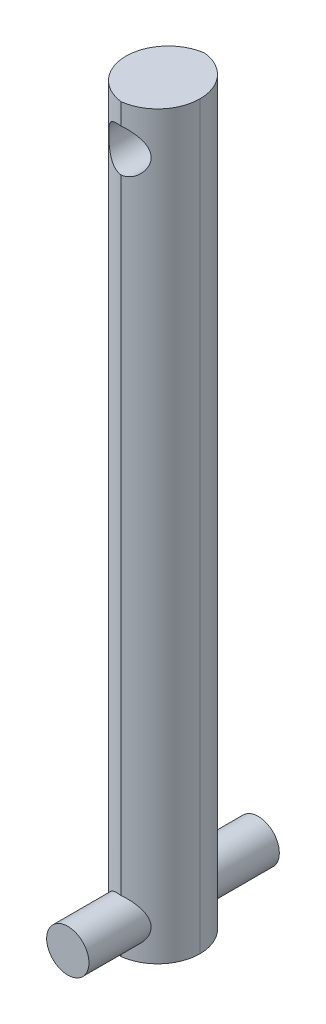
ISO-10303-21;
HEADER;
FILE_DESCRIPTION(('STEP AP214'),'2;1');
FILE_NAME('part.step','',(''),(''),'','','');
FILE_SCHEMA(('AUTOMOTIVE_DESIGN { 1 0 10303 214 1 1 1 1 }'));
ENDSEC;
DATA;
#1=APPLICATION_CONTEXT('core data for automotive mechanical design processes');
#2=APPLICATION_PROTOCOL_DEFINITION('international standard','automotive_design',2000,#1);
#3=PRODUCT_CONTEXT('',#1,'mechanical');
#4=PRODUCT('Part','Part','',(#3));
#5=PRODUCT_RELATED_PRODUCT_CATEGORY('part','',(#4));
#6=PRODUCT_DEFINITION_FORMATION('','',#4);
#7=PRODUCT_DEFINITION_CONTEXT('part definition',#1,'design');
#8=PRODUCT_DEFINITION('design','',#6,#7);
#9=PRODUCT_DEFINITION_SHAPE('','',#8);
#10=(LENGTH_UNIT() NAMED_UNIT(*) SI_UNIT(.MILLI.,.METRE.));
#11=(NAMED_UNIT(*) PLANE_ANGLE_UNIT() SI_UNIT($,.RADIAN.));
#12=(NAMED_UNIT(*) SI_UNIT($,.STERADIAN.) SOLID_ANGLE_UNIT());
#13=UNCERTAINTY_MEASURE_WITH_UNIT(LENGTH_MEASURE(1.E-05),#10,'distance_accuracy_value','');
#14=(GEOMETRIC_REPRESENTATION_CONTEXT(3) GLOBAL_UNCERTAINTY_ASSIGNED_CONTEXT((#13)) GLOBAL_UNIT_ASSIGNED_CONTEXT((#10,
#11,#12)) REPRESENTATION_CONTEXT('',''));
#15=CARTESIAN_POINT('',(0.,0.,0.));
#16=DIRECTION('',(0.,0.,1.));
#17=DIRECTION('',(1.,0.,0.));
#18=AXIS2_PLACEMENT_3D('',#15,#16,#17);
#19=CARTESIAN_POINT('',(0.,70.,0.));
#20=DIRECTION('',(0.,1.,0.));
#21=DIRECTION('',(0.,0.,1.));
#22=AXIS2_PLACEMENT_3D('',#19,#20,#21);
#23=PLANE('',#22);
#24=CARTESIAN_POINT('',(0.499999999999999,70.,0.));
#25=DIRECTION('',(0.,1.,0.));
#26=DIRECTION('',(0.,0.,1.));
#27=AXIS2_PLACEMENT_3D('',#24,#25,#26);
#28=CIRCLE('',#27,4.);
#29=CARTESIAN_POINT('',(0.,70.,-3.96862696659689));
#30=VERTEX_POINT('',#29);
#31=CARTESIAN_POINT('',(-3.5,70.,0.));
#32=VERTEX_POINT('',#31);
#33=EDGE_CURVE('E239',#30,#32,#28,.T.);
#34=ORIENTED_EDGE('',*,*,#33,.T.);
#35=CARTESIAN_POINT('',(0.5,70.,0.));
#36=DIRECTION('',(0.,1.,0.));
#37=DIRECTION('',(0.,0.,1.));
#38=AXIS2_PLACEMENT_3D('',#35,#36,#37);
#39=CIRCLE('',#38,4.);
#40=CARTESIAN_POINT('',(0.,70.,3.96862696659689));
#41=VERTEX_POINT('',#40);
#42=EDGE_CURVE('E241',#32,#41,#39,.T.);
#43=ORIENTED_EDGE('',*,*,#42,.T.);
#44=CARTESIAN_POINT('',(-0.500000000000001,70.,0.));
#45=DIRECTION('',(0.,1.,0.));
#46=DIRECTION('',(0.,0.,1.));
#47=AXIS2_PLACEMENT_3D('',#44,#45,#46);
#48=CIRCLE('',#47,4.);
#49=CARTESIAN_POINT('',(3.5,70.,0.));
#50=VERTEX_POINT('',#49);
#51=EDGE_CURVE('E251',#41,#50,#48,.T.);
#52=ORIENTED_EDGE('',*,*,#51,.T.);
#53=CARTESIAN_POINT('',(-0.500000000000001,70.,0.));
#54=DIRECTION('',(0.,1.,0.));
#55=DIRECTION('',(0.,0.,1.));
#56=AXIS2_PLACEMENT_3D('',#53,#54,#55);
#57=CIRCLE('',#56,4.);
#58=EDGE_CURVE('E243',#50,#30,#57,.T.);
#59=ORIENTED_EDGE('',*,*,#58,.T.);
#60=EDGE_LOOP('',(#34,#43,#52,#59));
#61=FACE_BOUND('',#60,.T.);
#62=ADVANCED_FACE('F36',(#61),#23,.T.);
#63=CARTESIAN_POINT('',(0.,0.,0.));
#64=DIRECTION('',(0.,1.,0.));
#65=DIRECTION('',(0.,0.,1.));
#66=AXIS2_PLACEMENT_3D('',#63,#64,#65);
#67=PLANE('',#66);
#68=CARTESIAN_POINT('',(-0.500000000000001,0.,0.));
#69=DIRECTION('',(0.,1.,0.));
#70=DIRECTION('',(0.,0.,1.));
#71=AXIS2_PLACEMENT_3D('',#68,#69,#70);
#72=CIRCLE('',#71,4.);
#73=CARTESIAN_POINT('',(3.5,0.,0.));
#74=VERTEX_POINT('',#73);
#75=CARTESIAN_POINT('',(0.,0.,3.96862696659689));
#76=VERTEX_POINT('',#75);
#77=EDGE_CURVE('E162',#74,#76,#72,.F.);
#78=ORIENTED_EDGE('',*,*,#77,.T.);
#79=CARTESIAN_POINT('',(0.5,0.,0.));
#80=DIRECTION('',(0.,1.,0.));
#81=DIRECTION('',(0.,0.,1.));
#82=AXIS2_PLACEMENT_3D('',#79,#80,#81);
#83=CIRCLE('',#82,4.);
#84=CARTESIAN_POINT('',(-3.5,0.,0.));
#85=VERTEX_POINT('',#84);
#86=EDGE_CURVE('E253',#76,#85,#83,.F.);
#87=ORIENTED_EDGE('',*,*,#86,.T.);
#88=CARTESIAN_POINT('',(0.499999999999999,0.,0.));
#89=DIRECTION('',(0.,1.,0.));
#90=DIRECTION('',(0.,0.,1.));
#91=AXIS2_PLACEMENT_3D('',#88,#89,#90);
#92=CIRCLE('',#91,4.);
#93=CARTESIAN_POINT('',(0.,0.,-3.96862696659689));
#94=VERTEX_POINT('',#93);
#95=EDGE_CURVE('E246',#85,#94,#92,.F.);
#96=ORIENTED_EDGE('',*,*,#95,.T.);
#97=CARTESIAN_POINT('',(-0.500000000000001,0.,0.));
#98=DIRECTION('',(0.,1.,0.));
#99=DIRECTION('',(0.,0.,1.));
#100=AXIS2_PLACEMENT_3D('',#97,#98,#99);
#101=CIRCLE('',#100,4.);
#102=EDGE_CURVE('E255',#94,#74,#101,.F.);
#103=ORIENTED_EDGE('',*,*,#102,.T.);
#104=EDGE_LOOP('',(#78,#87,#96,#103));
#105=FACE_BOUND('',#104,.T.);
#106=ADVANCED_FACE('F201',(#105),#67,.F.);
#107=CARTESIAN_POINT('',(0.,3.,9.));
#108=DIRECTION('',(0.,0.,-1.));
#109=DIRECTION('',(-1.,0.,0.));
#110=AXIS2_PLACEMENT_3D('',#107,#108,#109);
#111=CYLINDRICAL_SURFACE('',#110,2.);
#112=CARTESIAN_POINT('',(0.5,4.93649167310371,4.));
#113=CARTESIAN_POINT('',(0.449898213711408,4.94943630276601,4.0000084757813));
#114=CARTESIAN_POINT('',(0.399290992419128,4.96042062809628,3.99905888039407));
#115=CARTESIAN_POINT('',(0.297459695956404,4.97842926509832,3.9951915448379));
#116=CARTESIAN_POINT('',(0.24623572392714,4.98545422976407,3.99227412938437));
#117=CARTESIAN_POINT('',(0.143748569358789,4.99548941267685,3.98443451878896));
#118=CARTESIAN_POINT('',(0.0924863203256128,4.99851519483199,3.97952019344432));
#119=CARTESIAN_POINT('',(-0.00987579192626713,5.00063165175346,3.9677055210601));
#120=CARTESIAN_POINT('',(-0.0609756567118812,4.99972236460694,3.96080519324344));
#121=CARTESIAN_POINT('',(-0.213462949339357,4.99117271459405,3.93719455460474));
#122=CARTESIAN_POINT('',(-0.314143104794748,4.97772052579888,3.91756652682999));
#123=CARTESIAN_POINT('',(-0.510796630786406,4.93628949822271,3.8715024167525));
#124=CARTESIAN_POINT('',(-0.606767175422114,4.90830205175382,3.84506230505702));
#125=CARTESIAN_POINT('',(-0.795888590670208,4.83770558226319,3.78561661988295));
#126=CARTESIAN_POINT('',(-0.888760191973113,4.7945414340585,3.75238535036851));
#127=CARTESIAN_POINT('',(-1.06579824951565,4.69540144832138,3.68203355418914));
#128=CARTESIAN_POINT('',(-1.14995844070155,4.63941648202389,3.64491026656438));
#129=CARTESIAN_POINT('',(-1.31857523252845,4.50804385095609,3.56407007762064));
#130=CARTESIAN_POINT('',(-1.40170197190696,4.43109256298878,3.52011591145052));
#131=CARTESIAN_POINT('',(-1.55413925656711,4.26390328876383,3.43339544647966));
#132=CARTESIAN_POINT('',(-1.6234471661041,4.17366277347145,3.3906293756274));
#133=CARTESIAN_POINT('',(-1.73933260442552,3.9924152093942,3.31505671104817));
#134=CARTESIAN_POINT('',(-1.78762610011174,3.90275106533489,3.28167035071642));
#135=CARTESIAN_POINT('',(-1.87059535642194,3.71509190564798,3.22224945410434));
#136=CARTESIAN_POINT('',(-1.90529209448144,3.61711000932232,3.19620361025756));
#137=CARTESIAN_POINT('',(-1.95520044482526,3.43019681358217,3.15797895575985));
#138=CARTESIAN_POINT('',(-1.97257361367879,3.34215696815349,3.14429315353862));
#139=CARTESIAN_POINT('',(-1.99532215882044,3.16361290381631,3.12627393219687));
#140=CARTESIAN_POINT('',(-2.00070679659192,3.07311064194716,3.12193329375553));
#141=CARTESIAN_POINT('',(-1.9991428515402,2.89220791901244,3.1231850793711));
#142=CARTESIAN_POINT('',(-1.9921834015232,2.80180761782367,3.12878625576904));
#143=CARTESIAN_POINT('',(-1.96635792355013,2.62377912027089,3.14918060556321));
#144=CARTESIAN_POINT('',(-1.94748341658741,2.53615294470507,3.16398032472125));
#145=CARTESIAN_POINT('',(-1.89868598648104,2.36522005602709,3.20113098734281));
#146=CARTESIAN_POINT('',(-1.86870055241468,2.28194088359155,3.22352459292371));
#147=CARTESIAN_POINT('',(-1.79882882663401,2.12142883329628,3.27371863035324));
#148=CARTESIAN_POINT('',(-1.7589390937291,2.04419806921454,3.30152094069632));
#149=CARTESIAN_POINT('',(-1.66180801016099,1.88245772289171,3.36609435335858));
#150=CARTESIAN_POINT('',(-1.60271091916446,1.79934276242179,3.40356661233931));
#151=CARTESIAN_POINT('',(-1.47309351751366,1.6434268814037,3.48031443126954));
#152=CARTESIAN_POINT('',(-1.40256157419276,1.57063660704072,3.51959179808776));
#153=CARTESIAN_POINT('',(-1.23834811937297,1.42505297427927,3.60388875490698));
#154=CARTESIAN_POINT('',(-1.14276787776745,1.35429929664709,3.64876880739191));
#155=CARTESIAN_POINT('',(-0.939022597728698,1.23012631207511,3.73381661171037));
#156=CARTESIAN_POINT('',(-0.830860175257619,1.17670341061239,3.77398533960037));
#157=CARTESIAN_POINT('',(-0.606914077667901,1.09062816747962,3.84554645394042));
#158=CARTESIAN_POINT('',(-0.491364388214491,1.05752421647601,3.87712025907342));
#159=CARTESIAN_POINT('',(-0.25403924990622,1.01254275746465,3.93015624214466));
#160=CARTESIAN_POINT('',(-0.132274384240904,1.00063032840859,3.95163501240464));
#161=CARTESIAN_POINT('',(0.0755756782434498,0.999601353409247,3.97835565040634));
#162=CARTESIAN_POINT('',(0.161286462728574,1.00466877361815,3.98654588182258));
#163=CARTESIAN_POINT('',(0.289109719560697,1.02053901640595,3.99466595432612));
#164=CARTESIAN_POINT('',(0.331635068638044,1.02721792354052,3.99667835563151));
#165=CARTESIAN_POINT('',(0.416220298823656,1.04331489239075,3.99934710003158));
#166=CARTESIAN_POINT('',(0.458280039396193,1.05273375890984,4.00000304423681));
#167=CARTESIAN_POINT('',(0.499999999999999,1.06350832689629,4.));
#168=B_SPLINE_CURVE_WITH_KNOTS('',3,(#112,#113,#114,#115,#116,#117,#118,#119,#120,#121,#122,
#123,#124,#125,#126,#127,#128,#129,#130,#131,#132,#133,#134,#135,#136,#137,#138,#139,#140,#141,
#142,#143,#144,#145,#146,#147,#148,#149,#150,#151,#152,#153,#154,#155,#156,#157,#158,#159,#160,
#161,#162,#163,#164,#165,#166,#167),.UNSPECIFIED.,.F.,.F.,(4,2,2,2,2,2,2,2,2,2,2,2,2,2,2,2,2,2,
2,2,2,2,2,2,2,2,2,4),(0.,0.155190929887519,0.310356257556188,0.464915921386514,
0.619474089253012,0.928277095712766,1.23726318223839,1.55898509671673,1.88093680198791,
2.24393011363908,2.60699259499183,2.92728048348065,3.24707225936266,3.51820373743152,
3.78912568589004,4.06028626054952,4.33164001667028,4.60454420101769,4.87754333733461,
5.2022830312272,5.52735517976695,5.90684991063311,6.28626588126813,6.65691078362794,
7.0269443405436,7.2847971591131,7.41397767118808,7.54319616560595),.UNSPECIFIED.);
#169=CARTESIAN_POINT('',(0.,5.00000000000013,3.96862696659695));
#170=VERTEX_POINT('',#169);
#171=CARTESIAN_POINT('',(0.,1.,3.96862696659689));
#172=VERTEX_POINT('',#171);
#173=EDGE_CURVE('E109',#170,#172,#168,.T.);
#174=ORIENTED_EDGE('',*,*,#173,.T.);
#175=CARTESIAN_POINT('',(-0.5,1.06350832689629,4.));
#176=CARTESIAN_POINT('',(-0.449898213711409,1.05056369723399,4.0000084757813));
#177=CARTESIAN_POINT('',(-0.399290992419129,1.03957937190372,3.99905888039407));
#178=CARTESIAN_POINT('',(-0.297459695956405,1.02157073490168,3.9951915448379));
#179=CARTESIAN_POINT('',(-0.246235723927141,1.01454577023593,3.99227412938437));
#180=CARTESIAN_POINT('',(-0.143748569358789,1.00451058732315,3.98443451878896));
#181=CARTESIAN_POINT('',(-0.0924863203256135,1.00148480516801,3.97952019344432));
#182=CARTESIAN_POINT('',(0.00987579192626646,0.999368348246536,3.9677055210601));
#183=CARTESIAN_POINT('',(0.0609756567118805,1.00027763539306,3.96080519324344));
#184=CARTESIAN_POINT('',(0.213462949339356,1.00882728540595,3.93719455460474));
#185=CARTESIAN_POINT('',(0.314143104794748,1.02227947420112,3.91756652682999));
#186=CARTESIAN_POINT('',(0.510796630786406,1.06371050177729,3.8715024167525));
#187=CARTESIAN_POINT('',(0.606767175422113,1.09169794824618,3.84506230505702));
#188=CARTESIAN_POINT('',(0.795888590670208,1.16229441773681,3.78561661988295));
#189=CARTESIAN_POINT('',(0.888760191973113,1.2054585659415,3.75238535036851));
#190=CARTESIAN_POINT('',(1.06579824951565,1.30459855167862,3.68203355418914));
#191=CARTESIAN_POINT('',(1.14995844070155,1.36058351797611,3.64491026656438));
#192=CARTESIAN_POINT('',(1.31857523252845,1.49195614904391,3.56407007762064));
#193=CARTESIAN_POINT('',(1.40170197190696,1.56890743701122,3.52011591145052));
#194=CARTESIAN_POINT('',(1.55413925656711,1.73609671123617,3.43339544647966));
#195=CARTESIAN_POINT('',(1.6234471661041,1.82633722652855,3.3906293756274));
#196=CARTESIAN_POINT('',(1.73933260442552,2.0075847906058,3.31505671104817));
#197=CARTESIAN_POINT('',(1.78762610011174,2.09724893466511,3.28167035071642));
#198=CARTESIAN_POINT('',(1.87059535642194,2.28490809435202,3.22224945410434));
#199=CARTESIAN_POINT('',(1.90529209448144,2.38288999067768,3.19620361025756));
#200=CARTESIAN_POINT('',(1.95520044482526,2.56980318641783,3.15797895575985));
#201=CARTESIAN_POINT('',(1.97257361367879,2.65784303184651,3.14429315353862));
#202=CARTESIAN_POINT('',(1.99532215882044,2.83638709618369,3.12627393219688));
#203=CARTESIAN_POINT('',(2.00070679659191,2.92688935805284,3.12193329375553));
#204=CARTESIAN_POINT('',(1.9991428515402,3.10779208098756,3.1231850793711));
#205=CARTESIAN_POINT('',(1.9921834015232,3.19819238217633,3.12878625576904));
#206=CARTESIAN_POINT('',(1.96635792355013,3.37622087972911,3.14918060556321));
#207=CARTESIAN_POINT('',(1.94748341658741,3.46384705529493,3.16398032472125));
#208=CARTESIAN_POINT('',(1.89868598648104,3.63477994397291,3.20113098734281));
#209=CARTESIAN_POINT('',(1.86870055241468,3.71805911640845,3.22352459292371));
#210=CARTESIAN_POINT('',(1.79882882663401,3.87857116670371,3.27371863035324));
#211=CARTESIAN_POINT('',(1.7589390937291,3.95580193078546,3.30152094069631));
#212=CARTESIAN_POINT('',(1.66180801016099,4.11754227710829,3.36609435335858));
#213=CARTESIAN_POINT('',(1.60271091916446,4.20065723757821,3.40356661233931));
#214=CARTESIAN_POINT('',(1.47309351751366,4.3565731185963,3.48031443126954));
#215=CARTESIAN_POINT('',(1.40256157419276,4.42936339295928,3.51959179808776));
#216=CARTESIAN_POINT('',(1.23834811937297,4.57494702572073,3.60388875490698));
#217=CARTESIAN_POINT('',(1.14276787776745,4.64570070335291,3.64876880739191));
#218=CARTESIAN_POINT('',(0.939022597728699,4.76987368792488,3.73381661171037));
#219=CARTESIAN_POINT('',(0.83086017525762,4.82329658938761,3.77398533960037));
#220=CARTESIAN_POINT('',(0.606914077667902,4.90937183252038,3.84554645394042));
#221=CARTESIAN_POINT('',(0.491364388214492,4.94247578352399,3.87712025907342));
#222=CARTESIAN_POINT('',(0.25403924990622,4.98745724253535,3.93015624214466));
#223=CARTESIAN_POINT('',(0.132274384240904,4.99936967159141,3.95163501240464));
#224=CARTESIAN_POINT('',(-0.0755756782434494,5.00039864659075,3.97835565040634));
#225=CARTESIAN_POINT('',(-0.161286462728574,4.99533122638185,3.98654588182258));
#226=CARTESIAN_POINT('',(-0.289109719560698,4.97946098359405,3.99466595432612));
#227=CARTESIAN_POINT('',(-0.331635068638044,4.97278207645948,3.99667835563151));
#228=CARTESIAN_POINT('',(-0.416220298823656,4.95668510760925,3.99934710003158));
#229=CARTESIAN_POINT('',(-0.458280039396194,4.94726624109016,4.00000304423681));
#230=CARTESIAN_POINT('',(-0.5,4.93649167310371,4.));
#231=B_SPLINE_CURVE_WITH_KNOTS('',3,(#175,#176,#177,#178,#179,#180,#181,#182,#183,#184,#185,
#186,#187,#188,#189,#190,#191,#192,#193,#194,#195,#196,#197,#198,#199,#200,#201,#202,#203,#204,
#205,#206,#207,#208,#209,#210,#211,#212,#213,#214,#215,#216,#217,#218,#219,#220,#221,#222,#223,
#224,#225,#226,#227,#228,#229,#230),.UNSPECIFIED.,.F.,.F.,(4,2,2,2,2,2,2,2,2,2,2,2,2,2,2,2,2,2,
2,2,2,2,2,2,2,2,2,4),(0.,0.155190929887519,0.310356257556188,0.464915921386514,
0.619474089253012,0.928277095712767,1.23726318223839,1.55898509671674,1.88093680198791,
2.24393011363908,2.60699259499183,2.92728048348065,3.24707225936266,3.51820373743152,
3.78912568589004,4.06028626054952,4.33164001667028,4.60454420101769,4.87754333733461,
5.2022830312272,5.52735517976695,5.9068499106331,6.28626588126813,6.65691078362794,
7.0269443405436,7.2847971591131,7.41397767118808,7.54319616560595),.UNSPECIFIED.);
#232=EDGE_CURVE('E11',#172,#170,#231,.T.);
#233=ORIENTED_EDGE('',*,*,#232,.T.);
#234=EDGE_LOOP('',(#174,#233));
#235=FACE_BOUND('',#234,.T.);
#236=CARTESIAN_POINT('',(0.,3.,9.));
#237=DIRECTION('',(0.,0.,1.));
#238=DIRECTION('',(1.,0.,0.));
#239=AXIS2_PLACEMENT_3D('',#236,#237,#238);
#240=CIRCLE('',#239,2.);
#241=CARTESIAN_POINT('',(2.,3.,9.));
#242=VERTEX_POINT('',#241);
#243=EDGE_CURVE('E121',#242,#242,#240,.T.);
#244=ORIENTED_EDGE('',*,*,#243,.F.);
#245=EDGE_LOOP('',(#244));
#246=FACE_BOUND('',#245,.T.);
#247=ADVANCED_FACE('F196',(#235,#246),#111,.T.);
#248=CARTESIAN_POINT('',(0.,3.,9.));
#249=DIRECTION('',(0.,0.,1.));
#250=DIRECTION('',(1.,0.,0.));
#251=AXIS2_PLACEMENT_3D('',#248,#249,#250);
#252=PLANE('',#251);
#253=ORIENTED_EDGE('',*,*,#243,.T.);
#254=EDGE_LOOP('',(#253));
#255=FACE_BOUND('',#254,.T.);
#256=ADVANCED_FACE('F192',(#255),#252,.T.);
#257=CARTESIAN_POINT('',(0.,3.,-9.));
#258=DIRECTION('',(0.,0.,1.));
#259=DIRECTION('',(1.,0.,0.));
#260=AXIS2_PLACEMENT_3D('',#257,#258,#259);
#261=CYLINDRICAL_SURFACE('',#260,2.);
#262=CARTESIAN_POINT('',(0.5,1.06350832689629,-4.));
#263=CARTESIAN_POINT('',(0.449898213711408,1.05056369723399,-4.0000084757813));
#264=CARTESIAN_POINT('',(0.399290992419128,1.03957937190372,-3.99905888039407));
#265=CARTESIAN_POINT('',(0.297459695956404,1.02157073490168,-3.9951915448379));
#266=CARTESIAN_POINT('',(0.24623572392714,1.01454577023593,-3.99227412938437));
#267=CARTESIAN_POINT('',(0.143748569358788,1.00451058732315,-3.98443451878896));
#268=CARTESIAN_POINT('',(0.0924863203256126,1.00148480516801,-3.97952019344432));
#269=CARTESIAN_POINT('',(-0.00987579192626732,0.999368348246536,-3.9677055210601));
#270=CARTESIAN_POINT('',(-0.0609756567118813,1.00027763539306,-3.96080519324344));
#271=CARTESIAN_POINT('',(-0.213462949339357,1.00882728540595,-3.93719455460474));
#272=CARTESIAN_POINT('',(-0.314143104794749,1.02227947420112,-3.91756652682999));
#273=CARTESIAN_POINT('',(-0.510796630786407,1.06371050177729,-3.8715024167525));
#274=CARTESIAN_POINT('',(-0.606767175422114,1.09169794824618,-3.84506230505702));
#275=CARTESIAN_POINT('',(-0.795888590670208,1.16229441773681,-3.78561661988295));
#276=CARTESIAN_POINT('',(-0.888760191973113,1.2054585659415,-3.75238535036851));
#277=CARTESIAN_POINT('',(-1.06579824951565,1.30459855167862,-3.68203355418914));
#278=CARTESIAN_POINT('',(-1.14995844070155,1.36058351797611,-3.64491026656438));
#279=CARTESIAN_POINT('',(-1.31857523252845,1.49195614904391,-3.56407007762064));
#280=CARTESIAN_POINT('',(-1.40170197190696,1.56890743701122,-3.52011591145052));
#281=CARTESIAN_POINT('',(-1.55413925656711,1.73609671123617,-3.43339544647966));
#282=CARTESIAN_POINT('',(-1.6234471661041,1.82633722652855,-3.3906293756274));
#283=CARTESIAN_POINT('',(-1.73933260442552,2.0075847906058,-3.31505671104817));
#284=CARTESIAN_POINT('',(-1.78762610011174,2.09724893466511,-3.28167035071642));
#285=CARTESIAN_POINT('',(-1.87059535642194,2.28490809435202,-3.22224945410434));
#286=CARTESIAN_POINT('',(-1.90529209448144,2.38288999067768,-3.19620361025756));
#287=CARTESIAN_POINT('',(-1.95520044482526,2.56980318641782,-3.15797895575985));
#288=CARTESIAN_POINT('',(-1.97257361367879,2.65784303184651,-3.14429315353862));
#289=CARTESIAN_POINT('',(-1.99532215882044,2.83638709618369,-3.12627393219688));
#290=CARTESIAN_POINT('',(-2.00070679659192,2.92688935805284,-3.12193329375553));
#291=CARTESIAN_POINT('',(-1.9991428515402,3.10779208098756,-3.1231850793711));
#292=CARTESIAN_POINT('',(-1.9921834015232,3.19819238217633,-3.12878625576904));
#293=CARTESIAN_POINT('',(-1.96635792355013,3.37622087972911,-3.14918060556321));
#294=CARTESIAN_POINT('',(-1.94748341658741,3.46384705529493,-3.16398032472125));
#295=CARTESIAN_POINT('',(-1.89868598648104,3.63477994397291,-3.20113098734281));
#296=CARTESIAN_POINT('',(-1.86870055241468,3.71805911640845,-3.22352459292371));
#297=CARTESIAN_POINT('',(-1.79882882663401,3.87857116670371,-3.27371863035324));
#298=CARTESIAN_POINT('',(-1.75893909372911,3.95580193078546,-3.30152094069631));
#299=CARTESIAN_POINT('',(-1.66180801016099,4.11754227710829,-3.36609435335858));
#300=CARTESIAN_POINT('',(-1.60271091916447,4.20065723757821,-3.40356661233931));
#301=CARTESIAN_POINT('',(-1.47309351751366,4.3565731185963,-3.48031443126954));
#302=CARTESIAN_POINT('',(-1.40256157419277,4.42936339295928,-3.51959179808776));
#303=CARTESIAN_POINT('',(-1.23834811937297,4.57494702572073,-3.60388875490698));
#304=CARTESIAN_POINT('',(-1.14276787776745,4.64570070335291,-3.64876880739191));
#305=CARTESIAN_POINT('',(-0.939022597728701,4.76987368792488,-3.73381661171037));
#306=CARTESIAN_POINT('',(-0.830860175257621,4.82329658938761,-3.77398533960037));
#307=CARTESIAN_POINT('',(-0.606914077667903,4.90937183252038,-3.84554645394042));
#308=CARTESIAN_POINT('',(-0.491364388214493,4.94247578352399,-3.87712025907342));
#309=CARTESIAN_POINT('',(-0.254039249906221,4.98745724253535,-3.93015624214466));
#310=CARTESIAN_POINT('',(-0.132274384240905,4.99936967159141,-3.95163501240464));
#311=CARTESIAN_POINT('',(0.0755756782434483,5.00039864659075,-3.97835565040634));
#312=CARTESIAN_POINT('',(0.161286462728573,4.99533122638185,-3.98654588182258));
#313=CARTESIAN_POINT('',(0.289109719560697,4.97946098359405,-3.99466595432612));
#314=CARTESIAN_POINT('',(0.331635068638043,4.97278207645948,-3.99667835563151));
#315=CARTESIAN_POINT('',(0.416220298823655,4.95668510760925,-3.99934710003158));
#316=CARTESIAN_POINT('',(0.458280039396193,4.94726624109016,-4.00000304423681));
#317=CARTESIAN_POINT('',(0.499999999999999,4.93649167310371,-4.));
#318=B_SPLINE_CURVE_WITH_KNOTS('',3,(#262,#263,#264,#265,#266,#267,#268,#269,#270,#271,#272,
#273,#274,#275,#276,#277,#278,#279,#280,#281,#282,#283,#284,#285,#286,#287,#288,#289,#290,#291,
#292,#293,#294,#295,#296,#297,#298,#299,#300,#301,#302,#303,#304,#305,#306,#307,#308,#309,#310,
#311,#312,#313,#314,#315,#316,#317),.UNSPECIFIED.,.F.,.F.,(4,2,2,2,2,2,2,2,2,2,2,2,2,2,2,2,2,2,
2,2,2,2,2,2,2,2,2,4),(0.,0.155190929887519,0.310356257556188,0.464915921386514,
0.619474089253012,0.928277095712767,1.23726318223839,1.55898509671673,1.88093680198791,
2.24393011363908,2.60699259499183,2.92728048348065,3.24707225936266,3.51820373743152,
3.78912568589004,4.06028626054952,4.33164001667028,4.60454420101769,4.87754333733461,
5.2022830312272,5.52735517976695,5.9068499106331,6.28626588126813,6.65691078362794,
7.0269443405436,7.2847971591131,7.41397767118808,7.54319616560595),.UNSPECIFIED.);
#319=CARTESIAN_POINT('',(0.,0.999999999999871,-3.96862696659695));
#320=VERTEX_POINT('',#319);
#321=CARTESIAN_POINT('',(0.,5.,-3.96862696659689));
#322=VERTEX_POINT('',#321);
#323=EDGE_CURVE('E170',#320,#322,#318,.T.);
#324=ORIENTED_EDGE('',*,*,#323,.T.);
#325=CARTESIAN_POINT('',(-0.5,4.93649167310371,-4.));
#326=CARTESIAN_POINT('',(-0.449898213711409,4.94943630276601,-4.0000084757813));
#327=CARTESIAN_POINT('',(-0.399290992419129,4.96042062809628,-3.99905888039407));
#328=CARTESIAN_POINT('',(-0.297459695956404,4.97842926509832,-3.9951915448379));
#329=CARTESIAN_POINT('',(-0.246235723927141,4.98545422976407,-3.99227412938437));
#330=CARTESIAN_POINT('',(-0.143748569358789,4.99548941267685,-3.98443451878896));
#331=CARTESIAN_POINT('',(-0.0924863203256136,4.99851519483199,-3.97952019344432));
#332=CARTESIAN_POINT('',(0.00987579192626638,5.00063165175346,-3.9677055210601));
#333=CARTESIAN_POINT('',(0.0609756567118805,4.99972236460694,-3.96080519324344));
#334=CARTESIAN_POINT('',(0.213462949339356,4.99117271459405,-3.93719455460474));
#335=CARTESIAN_POINT('',(0.314143104794748,4.97772052579888,-3.91756652682999));
#336=CARTESIAN_POINT('',(0.510796630786405,4.93628949822271,-3.8715024167525));
#337=CARTESIAN_POINT('',(0.606767175422113,4.90830205175382,-3.84506230505702));
#338=CARTESIAN_POINT('',(0.795888590670207,4.83770558226319,-3.78561661988295));
#339=CARTESIAN_POINT('',(0.888760191973112,4.7945414340585,-3.75238535036851));
#340=CARTESIAN_POINT('',(1.06579824951565,4.69540144832138,-3.68203355418914));
#341=CARTESIAN_POINT('',(1.14995844070155,4.63941648202389,-3.64491026656438));
#342=CARTESIAN_POINT('',(1.31857523252845,4.50804385095609,-3.56407007762064));
#343=CARTESIAN_POINT('',(1.40170197190696,4.43109256298878,-3.52011591145052));
#344=CARTESIAN_POINT('',(1.55413925656711,4.26390328876383,-3.43339544647966));
#345=CARTESIAN_POINT('',(1.6234471661041,4.17366277347145,-3.3906293756274));
#346=CARTESIAN_POINT('',(1.73933260442552,3.9924152093942,-3.31505671104817));
#347=CARTESIAN_POINT('',(1.78762610011174,3.90275106533489,-3.28167035071642));
#348=CARTESIAN_POINT('',(1.87059535642194,3.71509190564798,-3.22224945410434));
#349=CARTESIAN_POINT('',(1.90529209448144,3.61711000932232,-3.19620361025756));
#350=CARTESIAN_POINT('',(1.95520044482526,3.43019681358218,-3.15797895575985));
#351=CARTESIAN_POINT('',(1.97257361367879,3.34215696815349,-3.14429315353862));
#352=CARTESIAN_POINT('',(1.99532215882044,3.16361290381631,-3.12627393219688));
#353=CARTESIAN_POINT('',(2.00070679659191,3.07311064194716,-3.12193329375553));
#354=CARTESIAN_POINT('',(1.9991428515402,2.89220791901244,-3.1231850793711));
#355=CARTESIAN_POINT('',(1.9921834015232,2.80180761782367,-3.12878625576904));
#356=CARTESIAN_POINT('',(1.96635792355013,2.62377912027089,-3.14918060556321));
#357=CARTESIAN_POINT('',(1.94748341658741,2.53615294470507,-3.16398032472125));
#358=CARTESIAN_POINT('',(1.89868598648104,2.36522005602709,-3.20113098734281));
#359=CARTESIAN_POINT('',(1.86870055241468,2.28194088359155,-3.22352459292371));
#360=CARTESIAN_POINT('',(1.79882882663401,2.12142883329629,-3.27371863035324));
#361=CARTESIAN_POINT('',(1.7589390937291,2.04419806921455,-3.30152094069632));
#362=CARTESIAN_POINT('',(1.66180801016099,1.88245772289171,-3.36609435335858));
#363=CARTESIAN_POINT('',(1.60271091916446,1.79934276242179,-3.40356661233931));
#364=CARTESIAN_POINT('',(1.47309351751366,1.6434268814037,-3.48031443126954));
#365=CARTESIAN_POINT('',(1.40256157419277,1.57063660704072,-3.51959179808776));
#366=CARTESIAN_POINT('',(1.23834811937297,1.42505297427927,-3.60388875490698));
#367=CARTESIAN_POINT('',(1.14276787776745,1.35429929664709,-3.6487688073919));
#368=CARTESIAN_POINT('',(0.9390225977287,1.23012631207512,-3.73381661171037));
#369=CARTESIAN_POINT('',(0.83086017525762,1.1767034106124,-3.77398533960037));
#370=CARTESIAN_POINT('',(0.606914077667902,1.09062816747962,-3.84554645394042));
#371=CARTESIAN_POINT('',(0.491364388214493,1.05752421647601,-3.87712025907342));
#372=CARTESIAN_POINT('',(0.254039249906221,1.01254275746465,-3.93015624214466));
#373=CARTESIAN_POINT('',(0.132274384240905,1.00063032840859,-3.95163501240464));
#374=CARTESIAN_POINT('',(-0.0755756782434485,0.999601353409247,-3.97835565040634));
#375=CARTESIAN_POINT('',(-0.161286462728573,1.00466877361815,-3.98654588182258));
#376=CARTESIAN_POINT('',(-0.289109719560697,1.02053901640595,-3.99466595432612));
#377=CARTESIAN_POINT('',(-0.331635068638044,1.02721792354052,-3.99667835563152));
#378=CARTESIAN_POINT('',(-0.416220298823656,1.04331489239075,-3.99934710003158));
#379=CARTESIAN_POINT('',(-0.458280039396193,1.05273375890984,-4.00000304423681));
#380=CARTESIAN_POINT('',(-0.5,1.06350832689629,-4.));
#381=B_SPLINE_CURVE_WITH_KNOTS('',3,(#325,#326,#327,#328,#329,#330,#331,#332,#333,#334,#335,
#336,#337,#338,#339,#340,#341,#342,#343,#344,#345,#346,#347,#348,#349,#350,#351,#352,#353,#354,
#355,#356,#357,#358,#359,#360,#361,#362,#363,#364,#365,#366,#367,#368,#369,#370,#371,#372,#373,
#374,#375,#376,#377,#378,#379,#380),.UNSPECIFIED.,.F.,.F.,(4,2,2,2,2,2,2,2,2,2,2,2,2,2,2,2,2,2,
2,2,2,2,2,2,2,2,2,4),(0.,0.155190929887519,0.310356257556188,0.464915921386514,
0.619474089253012,0.928277095712767,1.23726318223839,1.55898509671673,1.88093680198791,
2.24393011363908,2.60699259499183,2.92728048348065,3.24707225936266,3.51820373743152,
3.78912568589004,4.06028626054952,4.33164001667028,4.60454420101769,4.87754333733461,
5.2022830312272,5.52735517976695,5.9068499106331,6.28626588126813,6.65691078362794,
7.0269443405436,7.2847971591131,7.41397767118808,7.54319616560595),.UNSPECIFIED.);
#382=EDGE_CURVE('E47',#322,#320,#381,.T.);
#383=ORIENTED_EDGE('',*,*,#382,.T.);
#384=EDGE_LOOP('',(#324,#383));
#385=FACE_BOUND('',#384,.T.);
#386=CARTESIAN_POINT('',(0.,3.,-9.));
#387=DIRECTION('',(0.,0.,1.));
#388=DIRECTION('',(1.,0.,0.));
#389=AXIS2_PLACEMENT_3D('',#386,#387,#388);
#390=CIRCLE('',#389,2.);
#391=CARTESIAN_POINT('',(2.,3.,-9.));
#392=VERTEX_POINT('',#391);
#393=EDGE_CURVE('E217',#392,#392,#390,.T.);
#394=ORIENTED_EDGE('',*,*,#393,.T.);
#395=EDGE_LOOP('',(#394));
#396=FACE_BOUND('',#395,.T.);
#397=ADVANCED_FACE('F188',(#385,#396),#261,.T.);
#398=CARTESIAN_POINT('',(0.,3.,-9.));
#399=DIRECTION('',(0.,0.,-1.));
#400=DIRECTION('',(1.,0.,0.));
#401=AXIS2_PLACEMENT_3D('',#398,#399,#400);
#402=PLANE('',#401);
#403=ORIENTED_EDGE('',*,*,#393,.F.);
#404=EDGE_LOOP('',(#403));
#405=FACE_BOUND('',#404,.T.);
#406=ADVANCED_FACE('F150',(#405),#402,.T.);
#407=CARTESIAN_POINT('',(0.,66.,-9.001));
#408=DIRECTION('',(0.,0.,1.));
#409=DIRECTION('',(1.,0.,0.));
#410=AXIS2_PLACEMENT_3D('',#407,#408,#409);
#411=CYLINDRICAL_SURFACE('',#410,2.);
#412=CARTESIAN_POINT('',(-0.5,67.9364916731037,-4.));
#413=CARTESIAN_POINT('',(-0.449898213711409,67.949436302766,-4.0000084757813));
#414=CARTESIAN_POINT('',(-0.39929099241913,67.9604206280963,-3.99905888039407));
#415=CARTESIAN_POINT('',(-0.297459695956405,67.9784292650983,-3.9951915448379));
#416=CARTESIAN_POINT('',(-0.246235723927141,67.9854542297641,-3.99227412938437));
#417=CARTESIAN_POINT('',(-0.143748569358789,67.9954894126768,-3.98443451878896));
#418=CARTESIAN_POINT('',(-0.0924863203256134,67.998515194832,-3.97952019344432));
#419=CARTESIAN_POINT('',(0.00987579192626609,68.0006316517535,-3.9677055210601));
#420=CARTESIAN_POINT('',(0.06097565671188,67.9997223646069,-3.96080519324344));
#421=CARTESIAN_POINT('',(0.213462949339357,67.9911727145941,-3.93719455460474));
#422=CARTESIAN_POINT('',(0.31414310479475,67.9777205257989,-3.91756652682999));
#423=CARTESIAN_POINT('',(0.510796630786407,67.9362894982227,-3.8715024167525));
#424=CARTESIAN_POINT('',(0.606767175422113,67.9083020517538,-3.84506230505702));
#425=CARTESIAN_POINT('',(0.795888590670207,67.8377055822632,-3.78561661988295));
#426=CARTESIAN_POINT('',(0.888760191973113,67.7945414340585,-3.75238535036851));
#427=CARTESIAN_POINT('',(1.06579824951565,67.6954014483214,-3.68203355418914));
#428=CARTESIAN_POINT('',(1.14995844070155,67.6394164820239,-3.64491026656438));
#429=CARTESIAN_POINT('',(1.31857523252845,67.5080438509561,-3.56407007762064));
#430=CARTESIAN_POINT('',(1.40170197190696,67.4310925629888,-3.52011591145052));
#431=CARTESIAN_POINT('',(1.55413925656711,67.2639032887638,-3.43339544647966));
#432=CARTESIAN_POINT('',(1.6234471661041,67.1736627734715,-3.39062937562739));
#433=CARTESIAN_POINT('',(1.73933260442552,66.9924152093942,-3.31505671104817));
#434=CARTESIAN_POINT('',(1.78762610011174,66.9027510653349,-3.28167035071642));
#435=CARTESIAN_POINT('',(1.87059535642194,66.715091905648,-3.22224945410434));
#436=CARTESIAN_POINT('',(1.90529209448144,66.6171100093223,-3.19620361025756));
#437=CARTESIAN_POINT('',(1.95520044482526,66.4301968135822,-3.15797895575985));
#438=CARTESIAN_POINT('',(1.97257361367879,66.3421569681535,-3.14429315353862));
#439=CARTESIAN_POINT('',(1.99532215882044,66.1636129038163,-3.12627393219688));
#440=CARTESIAN_POINT('',(2.00070679659192,66.0731106419472,-3.12193329375553));
#441=CARTESIAN_POINT('',(1.9991428515402,65.8922079190125,-3.12318507937109));
#442=CARTESIAN_POINT('',(1.9921834015232,65.8018076178237,-3.12878625576904));
#443=CARTESIAN_POINT('',(1.96635792355014,65.6237791202709,-3.1491806055632));
#444=CARTESIAN_POINT('',(1.94748341658742,65.5361529447051,-3.16398032472124));
#445=CARTESIAN_POINT('',(1.89868598648104,65.3652200560271,-3.20113098734281));
#446=CARTESIAN_POINT('',(1.86870055241469,65.2819408835916,-3.2235245929237));
#447=CARTESIAN_POINT('',(1.79882882663402,65.1214288332963,-3.27371863035324));
#448=CARTESIAN_POINT('',(1.75893909372912,65.0441980692146,-3.30152094069631));
#449=CARTESIAN_POINT('',(1.66180801016101,64.8824577228917,-3.36609435335857));
#450=CARTESIAN_POINT('',(1.60271091916449,64.7993427624218,-3.4035666123393));
#451=CARTESIAN_POINT('',(1.47309351751369,64.6434268814037,-3.48031443126952));
#452=CARTESIAN_POINT('',(1.40256157419279,64.5706366070408,-3.51959179808775));
#453=CARTESIAN_POINT('',(1.238348119373,64.4250529742793,-3.60388875490697));
#454=CARTESIAN_POINT('',(1.14276787776748,64.3542992966471,-3.64876880739189));
#455=CARTESIAN_POINT('',(0.939022597728729,64.2301263120751,-3.73381661171036));
#456=CARTESIAN_POINT('',(0.83086017525765,64.1767034106124,-3.77398533960036));
#457=CARTESIAN_POINT('',(0.606914077667931,64.0906281674796,-3.84554645394041));
#458=CARTESIAN_POINT('',(0.491364388214521,64.057524216476,-3.87712025907342));
#459=CARTESIAN_POINT('',(0.25403924990625,64.0125427574647,-3.93015624214465));
#460=CARTESIAN_POINT('',(0.132274384240935,64.0006303284086,-3.95163501240464));
#461=CARTESIAN_POINT('',(-0.0755756782434217,63.9996013534092,-3.97835565040634));
#462=CARTESIAN_POINT('',(-0.16128646272855,64.0046687736181,-3.98654588182258));
#463=CARTESIAN_POINT('',(-0.289109719560684,64.020539016406,-3.99466595432612));
#464=CARTESIAN_POINT('',(-0.331635068638034,64.0272179235405,-3.99667835563151));
#465=CARTESIAN_POINT('',(-0.416220298823653,64.0433148923907,-3.99934710003158));
#466=CARTESIAN_POINT('',(-0.458280039396193,64.0527337589098,-4.00000304423681));
#467=CARTESIAN_POINT('',(-0.5,64.0635083268963,-4.));
#468=B_SPLINE_CURVE_WITH_KNOTS('',3,(#412,#413,#414,#415,#416,#417,#418,#419,#420,#421,#422,
#423,#424,#425,#426,#427,#428,#429,#430,#431,#432,#433,#434,#435,#436,#437,#438,#439,#440,#441,
#442,#443,#444,#445,#446,#447,#448,#449,#450,#451,#452,#453,#454,#455,#456,#457,#458,#459,#460,
#461,#462,#463,#464,#465,#466,#467),.UNSPECIFIED.,.F.,.F.,(4,2,2,2,2,2,2,2,2,2,2,2,2,2,2,2,2,2,
2,2,2,2,2,2,2,2,2,4),(0.,0.155190929887518,0.310356257556189,0.464915921386514,
0.619474089253011,0.928277095712769,1.23726318223839,1.55898509671674,1.88093680198791,
2.24393011363909,2.60699259499183,2.92728048348066,3.24707225936266,3.5182037374315,
3.78912568589002,4.0602862605495,4.33164001667027,4.60454420101767,4.87754333733458,
5.20228303122717,5.52735517976691,5.90684991063307,6.2862658812681,6.65691078362792,
7.02694434054357,7.28479715911309,7.41397767118808,7.54319616560596),.UNSPECIFIED.);
#469=CARTESIAN_POINT('',(0.,68.,-3.96862696659689));
#470=VERTEX_POINT('',#469);
#471=CARTESIAN_POINT('',(0.,64.,-3.96862696659689));
#472=VERTEX_POINT('',#471);
#473=EDGE_CURVE('E124',#470,#472,#468,.T.);
#474=ORIENTED_EDGE('',*,*,#473,.T.);
#475=CARTESIAN_POINT('',(0.5,64.0635083268963,-4.));
#476=CARTESIAN_POINT('',(0.449898213711408,64.050563697234,-4.0000084757813));
#477=CARTESIAN_POINT('',(0.399290992419127,64.0395793719037,-3.99905888039407));
#478=CARTESIAN_POINT('',(0.297459695956403,64.0215707349017,-3.9951915448379));
#479=CARTESIAN_POINT('',(0.246235723927139,64.0145457702359,-3.99227412938437));
#480=CARTESIAN_POINT('',(0.143748569358788,64.0045105873232,-3.98443451878896));
#481=CARTESIAN_POINT('',(0.0924863203256123,64.001484805168,-3.97952019344432));
#482=CARTESIAN_POINT('',(-0.00987579192626711,63.9993683482465,-3.9677055210601));
#483=CARTESIAN_POINT('',(-0.0609756567118808,64.0002776353931,-3.96080519324344));
#484=CARTESIAN_POINT('',(-0.213462949339357,64.0088272854059,-3.93719455460474));
#485=CARTESIAN_POINT('',(-0.314143104794751,64.0222794742011,-3.91756652682999));
#486=CARTESIAN_POINT('',(-0.510796630786408,64.0637105017773,-3.8715024167525));
#487=CARTESIAN_POINT('',(-0.606767175422114,64.0916979482462,-3.84506230505702));
#488=CARTESIAN_POINT('',(-0.795888590670208,64.1622944177368,-3.78561661988295));
#489=CARTESIAN_POINT('',(-0.888760191973114,64.2054585659415,-3.75238535036851));
#490=CARTESIAN_POINT('',(-1.06579824951565,64.3045985516786,-3.68203355418914));
#491=CARTESIAN_POINT('',(-1.14995844070155,64.3605835179761,-3.64491026656438));
#492=CARTESIAN_POINT('',(-1.31857523252846,64.4919561490439,-3.56407007762064));
#493=CARTESIAN_POINT('',(-1.40170197190696,64.5689074370112,-3.52011591145052));
#494=CARTESIAN_POINT('',(-1.55413925656711,64.7360967112362,-3.43339544647966));
#495=CARTESIAN_POINT('',(-1.62344716610411,64.8263372265285,-3.39062937562739));
#496=CARTESIAN_POINT('',(-1.73933260442552,65.0075847906058,-3.31505671104817));
#497=CARTESIAN_POINT('',(-1.78762610011174,65.0972489346651,-3.28167035071642));
#498=CARTESIAN_POINT('',(-1.87059535642194,65.284908094352,-3.22224945410434));
#499=CARTESIAN_POINT('',(-1.90529209448144,65.3828899906777,-3.19620361025756));
#500=CARTESIAN_POINT('',(-1.95520044482526,65.5698031864178,-3.15797895575985));
#501=CARTESIAN_POINT('',(-1.97257361367879,65.6578430318465,-3.14429315353862));
#502=CARTESIAN_POINT('',(-1.99532215882044,65.8363870961837,-3.12627393219688));
#503=CARTESIAN_POINT('',(-2.00070679659192,65.9268893580528,-3.12193329375553));
#504=CARTESIAN_POINT('',(-1.9991428515402,66.1077920809876,-3.12318507937109));
#505=CARTESIAN_POINT('',(-1.99218340152321,66.1981923821763,-3.12878625576904));
#506=CARTESIAN_POINT('',(-1.96635792355014,66.3762208797291,-3.1491806055632));
#507=CARTESIAN_POINT('',(-1.94748341658742,66.4638470552949,-3.16398032472124));
#508=CARTESIAN_POINT('',(-1.89868598648105,66.6347799439729,-3.20113098734281));
#509=CARTESIAN_POINT('',(-1.86870055241469,66.7180591164084,-3.2235245929237));
#510=CARTESIAN_POINT('',(-1.79882882663402,66.8785711667037,-3.27371863035324));
#511=CARTESIAN_POINT('',(-1.75893909372912,66.9558019307854,-3.30152094069631));
#512=CARTESIAN_POINT('',(-1.66180801016101,67.1175422771083,-3.36609435335857));
#513=CARTESIAN_POINT('',(-1.60271091916449,67.2006572375782,-3.4035666123393));
#514=CARTESIAN_POINT('',(-1.47309351751369,67.3565731185963,-3.48031443126952));
#515=CARTESIAN_POINT('',(-1.40256157419279,67.4293633929593,-3.51959179808775));
#516=CARTESIAN_POINT('',(-1.238348119373,67.5749470257207,-3.60388875490697));
#517=CARTESIAN_POINT('',(-1.14276787776748,67.6457007033529,-3.64876880739189));
#518=CARTESIAN_POINT('',(-0.93902259772873,67.7698736879249,-3.73381661171035));
#519=CARTESIAN_POINT('',(-0.830860175257651,67.8232965893876,-3.77398533960036));
#520=CARTESIAN_POINT('',(-0.606914077667932,67.9093718325204,-3.84554645394041));
#521=CARTESIAN_POINT('',(-0.491364388214522,67.942475783524,-3.87712025907341));
#522=CARTESIAN_POINT('',(-0.254039249906251,67.9874572425354,-3.93015624214465));
#523=CARTESIAN_POINT('',(-0.132274384240936,67.9993696715914,-3.95163501240464));
#524=CARTESIAN_POINT('',(0.0755756782434206,68.0003986465908,-3.97835565040634));
#525=CARTESIAN_POINT('',(0.161286462728549,67.9953312263819,-3.98654588182258));
#526=CARTESIAN_POINT('',(0.289109719560683,67.9794609835941,-3.99466595432612));
#527=CARTESIAN_POINT('',(0.331635068638033,67.9727820764595,-3.99667835563151));
#528=CARTESIAN_POINT('',(0.416220298823652,67.9566851076093,-3.99934710003158));
#529=CARTESIAN_POINT('',(0.458280039396192,67.9472662410902,-4.00000304423681));
#530=CARTESIAN_POINT('',(0.499999999999999,67.9364916731037,-4.));
#531=B_SPLINE_CURVE_WITH_KNOTS('',3,(#475,#476,#477,#478,#479,#480,#481,#482,#483,#484,#485,
#486,#487,#488,#489,#490,#491,#492,#493,#494,#495,#496,#497,#498,#499,#500,#501,#502,#503,#504,
#505,#506,#507,#508,#509,#510,#511,#512,#513,#514,#515,#516,#517,#518,#519,#520,#521,#522,#523,
#524,#525,#526,#527,#528,#529,#530),.UNSPECIFIED.,.F.,.F.,(4,2,2,2,2,2,2,2,2,2,2,2,2,2,2,2,2,2,
2,2,2,2,2,2,2,2,2,4),(0.,0.15519092988752,0.310356257556189,0.464915921386514,0.619474089253011,
0.928277095712769,1.23726318223839,1.55898509671674,1.88093680198791,2.24393011363909,
2.60699259499183,2.92728048348066,3.24707225936266,3.51820373743149,3.78912568589002,
4.0602862605495,4.33164001667027,4.60454420101767,4.87754333733458,5.20228303122717,
5.52735517976691,5.90684991063307,6.2862658812681,6.65691078362792,7.02694434054357,
7.28479715911309,7.41397767118808,7.54319616560596),.UNSPECIFIED.);
#532=EDGE_CURVE('E126',#472,#470,#531,.T.);
#533=ORIENTED_EDGE('',*,*,#532,.T.);
#534=EDGE_LOOP('',(#474,#533));
#535=FACE_BOUND('',#534,.T.);
#536=CARTESIAN_POINT('',(-0.5,64.0635083268963,4.));
#537=CARTESIAN_POINT('',(-0.44989821371141,64.050563697234,4.0000084757813));
#538=CARTESIAN_POINT('',(-0.39929099241913,64.0395793719037,3.99905888039407));
#539=CARTESIAN_POINT('',(-0.297459695956406,64.0215707349017,3.9951915448379));
#540=CARTESIAN_POINT('',(-0.246235723927141,64.0145457702359,3.99227412938437));
#541=CARTESIAN_POINT('',(-0.143748569358789,64.0045105873232,3.98443451878896));
#542=CARTESIAN_POINT('',(-0.0924863203256135,64.001484805168,3.97952019344432));
#543=CARTESIAN_POINT('',(0.00987579192626606,63.9993683482465,3.9677055210601));
#544=CARTESIAN_POINT('',(0.0609756567118799,64.0002776353931,3.96080519324344));
#545=CARTESIAN_POINT('',(0.213462949339357,64.0088272854059,3.93719455460474));
#546=CARTESIAN_POINT('',(0.31414310479475,64.0222794742011,3.91756652682999));
#547=CARTESIAN_POINT('',(0.510796630786407,64.0637105017773,3.8715024167525));
#548=CARTESIAN_POINT('',(0.606767175422113,64.0916979482462,3.84506230505702));
#549=CARTESIAN_POINT('',(0.795888590670207,64.1622944177368,3.78561661988295));
#550=CARTESIAN_POINT('',(0.888760191973113,64.2054585659415,3.75238535036851));
#551=CARTESIAN_POINT('',(1.06579824951565,64.3045985516786,3.68203355418914));
#552=CARTESIAN_POINT('',(1.14995844070155,64.3605835179761,3.64491026656438));
#553=CARTESIAN_POINT('',(1.31857523252845,64.4919561490439,3.56407007762064));
#554=CARTESIAN_POINT('',(1.40170197190696,64.5689074370112,3.52011591145052));
#555=CARTESIAN_POINT('',(1.55413925656711,64.7360967112362,3.43339544647966));
#556=CARTESIAN_POINT('',(1.6234471661041,64.8263372265285,3.39062937562739));
#557=CARTESIAN_POINT('',(1.73933260442552,65.0075847906058,3.31505671104817));
#558=CARTESIAN_POINT('',(1.78762610011174,65.0972489346651,3.28167035071642));
#559=CARTESIAN_POINT('',(1.87059535642194,65.284908094352,3.22224945410435));
#560=CARTESIAN_POINT('',(1.90529209448144,65.3828899906777,3.19620361025756));
#561=CARTESIAN_POINT('',(1.95520044482526,65.5698031864178,3.15797895575985));
#562=CARTESIAN_POINT('',(1.97257361367879,65.6578430318465,3.14429315353862));
#563=CARTESIAN_POINT('',(1.99532215882044,65.8363870961837,3.12627393219688));
#564=CARTESIAN_POINT('',(2.00070679659192,65.9268893580528,3.12193329375553));
#565=CARTESIAN_POINT('',(1.9991428515402,66.1077920809876,3.12318507937109));
#566=CARTESIAN_POINT('',(1.9921834015232,66.1981923821763,3.12878625576904));
#567=CARTESIAN_POINT('',(1.96635792355014,66.3762208797291,3.1491806055632));
#568=CARTESIAN_POINT('',(1.94748341658742,66.4638470552949,3.16398032472124));
#569=CARTESIAN_POINT('',(1.89868598648104,66.6347799439729,3.20113098734281));
#570=CARTESIAN_POINT('',(1.86870055241469,66.7180591164084,3.2235245929237));
#571=CARTESIAN_POINT('',(1.79882882663402,66.8785711667037,3.27371863035324));
#572=CARTESIAN_POINT('',(1.75893909372912,66.9558019307854,3.30152094069631));
#573=CARTESIAN_POINT('',(1.66180801016101,67.1175422771083,3.36609435335857));
#574=CARTESIAN_POINT('',(1.60271091916449,67.2006572375782,3.40356661233929));
#575=CARTESIAN_POINT('',(1.47309351751369,67.3565731185963,3.48031443126952));
#576=CARTESIAN_POINT('',(1.40256157419279,67.4293633929593,3.51959179808775));
#577=CARTESIAN_POINT('',(1.238348119373,67.5749470257207,3.60388875490697));
#578=CARTESIAN_POINT('',(1.14276787776748,67.6457007033529,3.64876880739189));
#579=CARTESIAN_POINT('',(0.939022597728729,67.7698736879249,3.73381661171036));
#580=CARTESIAN_POINT('',(0.830860175257649,67.8232965893876,3.77398533960036));
#581=CARTESIAN_POINT('',(0.60691407766793,67.9093718325204,3.84554645394041));
#582=CARTESIAN_POINT('',(0.49136438821452,67.942475783524,3.87712025907341));
#583=CARTESIAN_POINT('',(0.254039249906249,67.9874572425354,3.93015624214465));
#584=CARTESIAN_POINT('',(0.132274384240934,67.9993696715914,3.95163501240464));
#585=CARTESIAN_POINT('',(-0.0755756782434225,68.0003986465908,3.97835565040634));
#586=CARTESIAN_POINT('',(-0.161286462728551,67.9953312263819,3.98654588182258));
#587=CARTESIAN_POINT('',(-0.289109719560684,67.9794609835941,3.99466595432612));
#588=CARTESIAN_POINT('',(-0.331635068638034,67.9727820764595,3.99667835563151));
#589=CARTESIAN_POINT('',(-0.416220298823653,67.9566851076093,3.99934710003158));
#590=CARTESIAN_POINT('',(-0.458280039396193,67.9472662410902,4.00000304423681));
#591=CARTESIAN_POINT('',(-0.5,67.9364916731037,4.));
#592=B_SPLINE_CURVE_WITH_KNOTS('',3,(#536,#537,#538,#539,#540,#541,#542,#543,#544,#545,#546,
#547,#548,#549,#550,#551,#552,#553,#554,#555,#556,#557,#558,#559,#560,#561,#562,#563,#564,#565,
#566,#567,#568,#569,#570,#571,#572,#573,#574,#575,#576,#577,#578,#579,#580,#581,#582,#583,#584,
#585,#586,#587,#588,#589,#590,#591),.UNSPECIFIED.,.F.,.F.,(4,2,2,2,2,2,2,2,2,2,2,2,2,2,2,2,2,2,
2,2,2,2,2,2,2,2,2,4),(0.,0.155190929887518,0.310356257556189,0.464915921386514,
0.619474089253011,0.928277095712769,1.23726318223839,1.55898509671674,1.88093680198791,
2.24393011363909,2.60699259499183,2.92728048348066,3.24707225936266,3.51820373743149,
3.78912568589002,4.0602862605495,4.33164001667027,4.60454420101767,4.87754333733458,
5.20228303122717,5.52735517976691,5.90684991063307,6.2862658812681,6.65691078362792,
7.02694434054357,7.28479715911309,7.41397767118808,7.54319616560596),.UNSPECIFIED.);
#593=CARTESIAN_POINT('',(0.,64.,3.96862696659689));
#594=VERTEX_POINT('',#593);
#595=CARTESIAN_POINT('',(0.,68.,3.96862696659689));
#596=VERTEX_POINT('',#595);
#597=EDGE_CURVE('E116',#594,#596,#592,.T.);
#598=ORIENTED_EDGE('',*,*,#597,.T.);
#599=CARTESIAN_POINT('',(0.5,67.9364916731037,4.));
#600=CARTESIAN_POINT('',(0.449898213711408,67.949436302766,4.0000084757813));
#601=CARTESIAN_POINT('',(0.399290992419127,67.9604206280963,3.99905888039407));
#602=CARTESIAN_POINT('',(0.297459695956403,67.9784292650983,3.9951915448379));
#603=CARTESIAN_POINT('',(0.246235723927139,67.9854542297641,3.99227412938437));
#604=CARTESIAN_POINT('',(0.143748569358788,67.9954894126768,3.98443451878896));
#605=CARTESIAN_POINT('',(0.0924863203256124,67.998515194832,3.97952019344432));
#606=CARTESIAN_POINT('',(-0.00987579192626706,68.0006316517535,3.9677055210601));
#607=CARTESIAN_POINT('',(-0.0609756567118809,67.9997223646069,3.96080519324344));
#608=CARTESIAN_POINT('',(-0.213462949339358,67.9911727145941,3.93719455460474));
#609=CARTESIAN_POINT('',(-0.314143104794751,67.9777205257989,3.91756652682999));
#610=CARTESIAN_POINT('',(-0.510796630786408,67.9362894982227,3.8715024167525));
#611=CARTESIAN_POINT('',(-0.606767175422114,67.9083020517538,3.84506230505702));
#612=CARTESIAN_POINT('',(-0.795888590670208,67.8377055822632,3.78561661988295));
#613=CARTESIAN_POINT('',(-0.888760191973114,67.7945414340585,3.75238535036851));
#614=CARTESIAN_POINT('',(-1.06579824951565,67.6954014483214,3.68203355418913));
#615=CARTESIAN_POINT('',(-1.14995844070155,67.6394164820239,3.64491026656438));
#616=CARTESIAN_POINT('',(-1.31857523252846,67.5080438509561,3.56407007762064));
#617=CARTESIAN_POINT('',(-1.40170197190696,67.4310925629888,3.52011591145052));
#618=CARTESIAN_POINT('',(-1.55413925656711,67.2639032887638,3.43339544647966));
#619=CARTESIAN_POINT('',(-1.62344716610411,67.1736627734715,3.39062937562739));
#620=CARTESIAN_POINT('',(-1.73933260442552,66.9924152093942,3.31505671104817));
#621=CARTESIAN_POINT('',(-1.78762610011174,66.9027510653349,3.28167035071642));
#622=CARTESIAN_POINT('',(-1.87059535642194,66.715091905648,3.22224945410434));
#623=CARTESIAN_POINT('',(-1.90529209448144,66.6171100093223,3.19620361025756));
#624=CARTESIAN_POINT('',(-1.95520044482526,66.4301968135822,3.15797895575985));
#625=CARTESIAN_POINT('',(-1.97257361367879,66.3421569681535,3.14429315353862));
#626=CARTESIAN_POINT('',(-1.99532215882044,66.1636129038163,3.12627393219688));
#627=CARTESIAN_POINT('',(-2.00070679659192,66.0731106419472,3.12193329375553));
#628=CARTESIAN_POINT('',(-1.9991428515402,65.8922079190125,3.12318507937109));
#629=CARTESIAN_POINT('',(-1.99218340152321,65.8018076178237,3.12878625576904));
#630=CARTESIAN_POINT('',(-1.96635792355014,65.6237791202709,3.1491806055632));
#631=CARTESIAN_POINT('',(-1.94748341658742,65.5361529447051,3.16398032472124));
#632=CARTESIAN_POINT('',(-1.89868598648105,65.3652200560271,3.20113098734281));
#633=CARTESIAN_POINT('',(-1.86870055241469,65.2819408835916,3.2235245929237));
#634=CARTESIAN_POINT('',(-1.79882882663402,65.1214288332963,3.27371863035324));
#635=CARTESIAN_POINT('',(-1.75893909372912,65.0441980692146,3.30152094069631));
#636=CARTESIAN_POINT('',(-1.66180801016101,64.8824577228918,3.36609435335857));
#637=CARTESIAN_POINT('',(-1.60271091916449,64.7993427624218,3.40356661233929));
#638=CARTESIAN_POINT('',(-1.47309351751369,64.6434268814037,3.48031443126952));
#639=CARTESIAN_POINT('',(-1.40256157419279,64.5706366070408,3.51959179808775));
#640=CARTESIAN_POINT('',(-1.238348119373,64.4250529742793,3.60388875490697));
#641=CARTESIAN_POINT('',(-1.14276787776748,64.3542992966471,3.64876880739189));
#642=CARTESIAN_POINT('',(-0.93902259772873,64.2301263120751,3.73381661171035));
#643=CARTESIAN_POINT('',(-0.830860175257651,64.1767034106124,3.77398533960036));
#644=CARTESIAN_POINT('',(-0.606914077667932,64.0906281674796,3.84554645394041));
#645=CARTESIAN_POINT('',(-0.491364388214522,64.057524216476,3.87712025907341));
#646=CARTESIAN_POINT('',(-0.25403924990625,64.0125427574647,3.93015624214465));
#647=CARTESIAN_POINT('',(-0.132274384240935,64.0006303284086,3.95163501240464));
#648=CARTESIAN_POINT('',(0.0755756782434217,63.9996013534092,3.97835565040634));
#649=CARTESIAN_POINT('',(0.16128646272855,64.0046687736181,3.98654588182258));
#650=CARTESIAN_POINT('',(0.289109719560684,64.020539016406,3.99466595432612));
#651=CARTESIAN_POINT('',(0.331635068638034,64.0272179235405,3.99667835563151));
#652=CARTESIAN_POINT('',(0.416220298823652,64.0433148923907,3.99934710003158));
#653=CARTESIAN_POINT('',(0.458280039396192,64.0527337589098,4.00000304423681));
#654=CARTESIAN_POINT('',(0.5,64.0635083268963,4.));
#655=B_SPLINE_CURVE_WITH_KNOTS('',3,(#599,#600,#601,#602,#603,#604,#605,#606,#607,#608,#609,
#610,#611,#612,#613,#614,#615,#616,#617,#618,#619,#620,#621,#622,#623,#624,#625,#626,#627,#628,
#629,#630,#631,#632,#633,#634,#635,#636,#637,#638,#639,#640,#641,#642,#643,#644,#645,#646,#647,
#648,#649,#650,#651,#652,#653,#654),.UNSPECIFIED.,.F.,.F.,(4,2,2,2,2,2,2,2,2,2,2,2,2,2,2,2,2,2,
2,2,2,2,2,2,2,2,2,4),(0.,0.15519092988752,0.310356257556189,0.464915921386514,0.619474089253011,
0.928277095712769,1.23726318223839,1.55898509671674,1.88093680198791,2.24393011363909,
2.60699259499183,2.92728048348066,3.24707225936266,3.5182037374315,3.78912568589002,
4.0602862605495,4.33164001667027,4.60454420101767,4.87754333733458,5.20228303122717,
5.52735517976691,5.90684991063307,6.2862658812681,6.65691078362792,7.02694434054357,
7.2847971591131,7.41397767118808,7.54319616560596),.UNSPECIFIED.);
#656=EDGE_CURVE('E107',#596,#594,#655,.T.);
#657=ORIENTED_EDGE('',*,*,#656,.T.);
#658=EDGE_LOOP('',(#598,#657));
#659=FACE_BOUND('',#658,.T.);
#660=ADVANCED_FACE('F123',(#535,#659),#411,.F.);
#661=CARTESIAN_POINT('',(-0.500000000000001,70.,0.));
#662=DIRECTION('',(0.,-1.,0.));
#663=DIRECTION('',(0.,0.,-1.));
#664=AXIS2_PLACEMENT_3D('',#661,#662,#663);
#665=CYLINDRICAL_SURFACE('',#664,4.);
#666=DIRECTION('',(0.,-1.,0.));
#667=VECTOR('',#666,1.);
#668=CARTESIAN_POINT('',(3.5,70.,0.));
#669=LINE('',#668,#667);
#670=EDGE_CURVE('E213',#74,#50,#669,.F.);
#671=ORIENTED_EDGE('',*,*,#670,.F.);
#672=ORIENTED_EDGE('',*,*,#102,.F.);
#673=DIRECTION('',(0.,-1.,0.));
#674=VECTOR('',#673,1.);
#675=CARTESIAN_POINT('',(0.,35.,-3.96862696659689));
#676=LINE('',#675,#674);
#677=EDGE_CURVE('E41',#320,#94,#676,.T.);
#678=ORIENTED_EDGE('',*,*,#677,.F.);
#679=ORIENTED_EDGE('',*,*,#382,.F.);
#680=DIRECTION('',(0.,-1.,0.));
#681=VECTOR('',#680,1.);
#682=CARTESIAN_POINT('',(0.,35.,-3.96862696659689));
#683=LINE('',#682,#681);
#684=EDGE_CURVE('E54',#472,#322,#683,.T.);
#685=ORIENTED_EDGE('',*,*,#684,.F.);
#686=ORIENTED_EDGE('',*,*,#473,.F.);
#687=DIRECTION('',(0.,-1.,0.));
#688=VECTOR('',#687,1.);
#689=CARTESIAN_POINT('',(0.,35.,-3.96862696659689));
#690=LINE('',#689,#688);
#691=EDGE_CURVE('E215',#30,#470,#690,.T.);
#692=ORIENTED_EDGE('',*,*,#691,.F.);
#693=ORIENTED_EDGE('',*,*,#58,.F.);
#694=EDGE_LOOP('',(#671,#672,#678,#679,#685,#686,#692,#693));
#695=FACE_BOUND('',#694,.T.);
#696=ADVANCED_FACE('F38',(#695),#665,.T.);
#697=CARTESIAN_POINT('',(0.499999999999999,70.,0.));
#698=DIRECTION('',(0.,-1.,0.));
#699=DIRECTION('',(0.,0.,-1.));
#700=AXIS2_PLACEMENT_3D('',#697,#698,#699);
#701=CYLINDRICAL_SURFACE('',#700,4.);
#702=ORIENTED_EDGE('',*,*,#677,.T.);
#703=ORIENTED_EDGE('',*,*,#95,.F.);
#704=DIRECTION('',(0.,-1.,0.));
#705=VECTOR('',#704,1.);
#706=CARTESIAN_POINT('',(-3.5,70.,0.));
#707=LINE('',#706,#705);
#708=EDGE_CURVE('E211',#32,#85,#707,.T.);
#709=ORIENTED_EDGE('',*,*,#708,.F.);
#710=ORIENTED_EDGE('',*,*,#33,.F.);
#711=ORIENTED_EDGE('',*,*,#691,.T.);
#712=ORIENTED_EDGE('',*,*,#532,.F.);
#713=ORIENTED_EDGE('',*,*,#684,.T.);
#714=ORIENTED_EDGE('',*,*,#323,.F.);
#715=EDGE_LOOP('',(#702,#703,#709,#710,#711,#712,#713,#714));
#716=FACE_BOUND('',#715,.T.);
#717=ADVANCED_FACE('F164',(#716),#701,.T.);
#718=CARTESIAN_POINT('',(-0.500000000000001,70.,0.));
#719=DIRECTION('',(0.,-1.,0.));
#720=DIRECTION('',(0.,0.,-1.));
#721=AXIS2_PLACEMENT_3D('',#718,#719,#720);
#722=CYLINDRICAL_SURFACE('',#721,4.);
#723=ORIENTED_EDGE('',*,*,#670,.T.);
#724=ORIENTED_EDGE('',*,*,#51,.F.);
#725=DIRECTION('',(0.,-1.,0.));
#726=VECTOR('',#725,1.);
#727=CARTESIAN_POINT('',(0.,35.,3.96862696659689));
#728=LINE('',#727,#726);
#729=EDGE_CURVE('E112',#596,#41,#728,.F.);
#730=ORIENTED_EDGE('',*,*,#729,.F.);
#731=ORIENTED_EDGE('',*,*,#597,.F.);
#732=DIRECTION('',(0.,-1.,0.));
#733=VECTOR('',#732,1.);
#734=CARTESIAN_POINT('',(0.,35.,3.96862696659689));
#735=LINE('',#734,#733);
#736=EDGE_CURVE('E102',#170,#594,#735,.F.);
#737=ORIENTED_EDGE('',*,*,#736,.F.);
#738=ORIENTED_EDGE('',*,*,#232,.F.);
#739=DIRECTION('',(0.,-1.,0.));
#740=VECTOR('',#739,1.);
#741=CARTESIAN_POINT('',(0.,35.,3.96862696659689));
#742=LINE('',#741,#740);
#743=EDGE_CURVE('E113',#76,#172,#742,.F.);
#744=ORIENTED_EDGE('',*,*,#743,.F.);
#745=ORIENTED_EDGE('',*,*,#77,.F.);
#746=EDGE_LOOP('',(#723,#724,#730,#731,#737,#738,#744,#745));
#747=FACE_BOUND('',#746,.T.);
#748=ADVANCED_FACE('F118',(#747),#722,.T.);
#749=CARTESIAN_POINT('',(0.5,70.,0.));
#750=DIRECTION('',(0.,-1.,0.));
#751=DIRECTION('',(0.,0.,-1.));
#752=AXIS2_PLACEMENT_3D('',#749,#750,#751);
#753=CYLINDRICAL_SURFACE('',#752,4.);
#754=ORIENTED_EDGE('',*,*,#42,.F.);
#755=ORIENTED_EDGE('',*,*,#708,.T.);
#756=ORIENTED_EDGE('',*,*,#86,.F.);
#757=ORIENTED_EDGE('',*,*,#743,.T.);
#758=ORIENTED_EDGE('',*,*,#173,.F.);
#759=ORIENTED_EDGE('',*,*,#736,.T.);
#760=ORIENTED_EDGE('',*,*,#656,.F.);
#761=ORIENTED_EDGE('',*,*,#729,.T.);
#762=EDGE_LOOP('',(#754,#755,#756,#757,#758,#759,#760,#761));
#763=FACE_BOUND('',#762,.T.);
#764=ADVANCED_FACE('F105',(#763),#753,.T.);
#765=CLOSED_SHELL('',(#62,#106,#247,#256,#397,#406,#660,#696,#717,#748,#764));
#766=MANIFOLD_SOLID_BREP('B2',#765);
#767=ADVANCED_BREP_SHAPE_REPRESENTATION('',(#18,#766),#14);
#768=SHAPE_DEFINITION_REPRESENTATION(#9,#767);
ENDSEC;
END-ISO-10303-21;
